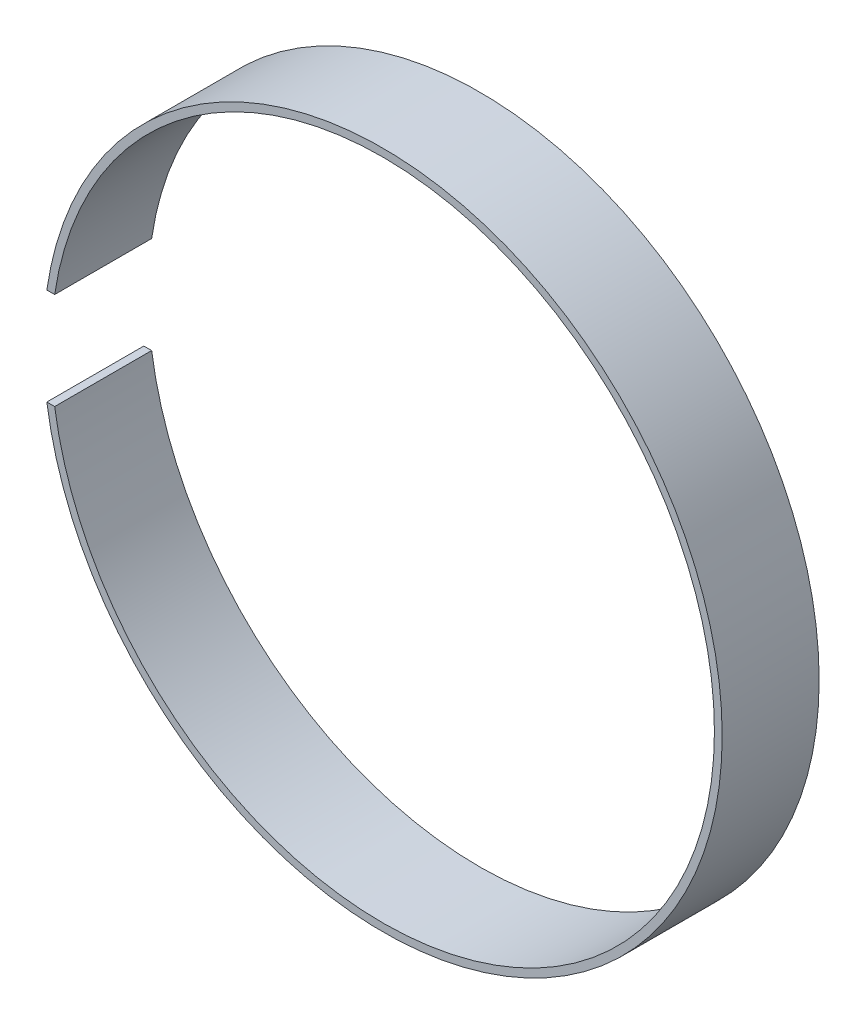
ISO-10303-21;
HEADER;
FILE_DESCRIPTION(('STEP AP214'),'2;1');
FILE_NAME('part.step','',(''),(''),'','','');
FILE_SCHEMA(('AUTOMOTIVE_DESIGN { 1 0 10303 214 1 1 1 1 }'));
ENDSEC;
DATA;
#1=APPLICATION_CONTEXT('core data for automotive mechanical design processes');
#2=APPLICATION_PROTOCOL_DEFINITION('international standard','automotive_design',2000,#1);
#3=PRODUCT_CONTEXT('',#1,'mechanical');
#4=PRODUCT('Part','Part','',(#3));
#5=PRODUCT_RELATED_PRODUCT_CATEGORY('part','',(#4));
#6=PRODUCT_DEFINITION_FORMATION('','',#4);
#7=PRODUCT_DEFINITION_CONTEXT('part definition',#1,'design');
#8=PRODUCT_DEFINITION('design','',#6,#7);
#9=PRODUCT_DEFINITION_SHAPE('','',#8);
#10=(LENGTH_UNIT() NAMED_UNIT(*) SI_UNIT(.MILLI.,.METRE.));
#11=(NAMED_UNIT(*) PLANE_ANGLE_UNIT() SI_UNIT($,.RADIAN.));
#12=(NAMED_UNIT(*) SI_UNIT($,.STERADIAN.) SOLID_ANGLE_UNIT());
#13=UNCERTAINTY_MEASURE_WITH_UNIT(LENGTH_MEASURE(1.E-05),#10,'distance_accuracy_value','');
#14=(GEOMETRIC_REPRESENTATION_CONTEXT(3) GLOBAL_UNCERTAINTY_ASSIGNED_CONTEXT((#13)) GLOBAL_UNIT_ASSIGNED_CONTEXT((#10,
#11,#12)) REPRESENTATION_CONTEXT('',''));
#15=CARTESIAN_POINT('',(0.,0.,0.));
#16=DIRECTION('',(0.,0.,1.));
#17=DIRECTION('',(1.,0.,0.));
#18=AXIS2_PLACEMENT_3D('',#15,#16,#17);
#19=CARTESIAN_POINT('',(0.,0.,250.));
#20=DIRECTION('',(0.,0.,-1.));
#21=DIRECTION('',(-1.,0.,0.));
#22=AXIS2_PLACEMENT_3D('',#19,#20,#21);
#23=CYLINDRICAL_SURFACE('',#22,875.);
#24=CARTESIAN_POINT('',(0.,0.,0.));
#25=DIRECTION('',(0.,0.,1.));
#26=DIRECTION('',(1.,0.,0.));
#27=AXIS2_PLACEMENT_3D('',#24,#25,#26);
#28=CIRCLE('',#27,875.);
#29=CARTESIAN_POINT('',(-866.025403784439,-125.,0.));
#30=VERTEX_POINT('',#29);
#31=CARTESIAN_POINT('',(-866.025403784439,125.,0.));
#32=VERTEX_POINT('',#31);
#33=EDGE_CURVE('E95',#30,#32,#28,.T.);
#34=ORIENTED_EDGE('',*,*,#33,.T.);
#35=DIRECTION('',(0.,0.,-1.));
#36=VECTOR('',#35,1.);
#37=CARTESIAN_POINT('',(-866.025403784439,125.,250.));
#38=LINE('',#37,#36);
#39=CARTESIAN_POINT('',(-866.025403784439,125.,250.));
#40=VERTEX_POINT('',#39);
#41=EDGE_CURVE('E11',#40,#32,#38,.T.);
#42=ORIENTED_EDGE('',*,*,#41,.F.);
#43=CARTESIAN_POINT('',(0.,0.,250.));
#44=DIRECTION('',(0.,0.,1.));
#45=DIRECTION('',(1.,0.,0.));
#46=AXIS2_PLACEMENT_3D('',#43,#44,#45);
#47=CIRCLE('',#46,875.);
#48=CARTESIAN_POINT('',(-866.025403784439,-125.,250.));
#49=VERTEX_POINT('',#48);
#50=EDGE_CURVE('E83',#49,#40,#47,.T.);
#51=ORIENTED_EDGE('',*,*,#50,.F.);
#52=DIRECTION('',(0.,0.,-1.));
#53=VECTOR('',#52,1.);
#54=CARTESIAN_POINT('',(-866.025403784439,-125.,250.));
#55=LINE('',#54,#53);
#56=EDGE_CURVE('E91',#49,#30,#55,.T.);
#57=ORIENTED_EDGE('',*,*,#56,.T.);
#58=EDGE_LOOP('',(#34,#42,#51,#57));
#59=FACE_BOUND('',#58,.T.);
#60=ADVANCED_FACE('F32',(#59),#23,.T.);
#61=CARTESIAN_POINT('',(-866.025403784439,125.,250.));
#62=DIRECTION('',(0.,1.,0.));
#63=DIRECTION('',(0.,0.,1.));
#64=AXIS2_PLACEMENT_3D('',#61,#62,#63);
#65=PLANE('',#64);
#66=DIRECTION('',(1.,0.,0.));
#67=VECTOR('',#66,1.);
#68=CARTESIAN_POINT('',(-866.025403784439,125.,0.));
#69=LINE('',#68,#67);
#70=CARTESIAN_POINT('',(-845.81321815162,125.,0.));
#71=VERTEX_POINT('',#70);
#72=EDGE_CURVE('E87',#32,#71,#69,.T.);
#73=ORIENTED_EDGE('',*,*,#72,.T.);
#74=DIRECTION('',(0.,0.,-1.));
#75=VECTOR('',#74,1.);
#76=CARTESIAN_POINT('',(-845.81321815162,125.,250.));
#77=LINE('',#76,#75);
#78=CARTESIAN_POINT('',(-845.81321815162,125.,250.));
#79=VERTEX_POINT('',#78);
#80=EDGE_CURVE('E40',#79,#71,#77,.T.);
#81=ORIENTED_EDGE('',*,*,#80,.F.);
#82=DIRECTION('',(1.,0.,0.));
#83=VECTOR('',#82,1.);
#84=CARTESIAN_POINT('',(-866.025403784439,125.,250.));
#85=LINE('',#84,#83);
#86=EDGE_CURVE('E78',#40,#79,#85,.T.);
#87=ORIENTED_EDGE('',*,*,#86,.F.);
#88=ORIENTED_EDGE('',*,*,#41,.T.);
#89=EDGE_LOOP('',(#73,#81,#87,#88));
#90=FACE_BOUND('',#89,.T.);
#91=ADVANCED_FACE('F86',(#90),#65,.F.);
#92=CARTESIAN_POINT('',(0.,0.,250.));
#93=DIRECTION('',(0.,0.,-1.));
#94=DIRECTION('',(-1.,0.,0.));
#95=AXIS2_PLACEMENT_3D('',#92,#93,#94);
#96=CYLINDRICAL_SURFACE('',#95,855.);
#97=CARTESIAN_POINT('',(0.,0.,0.));
#98=DIRECTION('',(0.,0.,-1.));
#99=DIRECTION('',(1.,0.,0.));
#100=AXIS2_PLACEMENT_3D('',#97,#98,#99);
#101=CIRCLE('',#100,855.);
#102=CARTESIAN_POINT('',(-845.81321815162,-125.,0.));
#103=VERTEX_POINT('',#102);
#104=EDGE_CURVE('E65',#71,#103,#101,.T.);
#105=ORIENTED_EDGE('',*,*,#104,.T.);
#106=DIRECTION('',(0.,0.,-1.));
#107=VECTOR('',#106,1.);
#108=CARTESIAN_POINT('',(-845.81321815162,-125.,250.));
#109=LINE('',#108,#107);
#110=CARTESIAN_POINT('',(-845.81321815162,-125.,250.));
#111=VERTEX_POINT('',#110);
#112=EDGE_CURVE('E88',#111,#103,#109,.T.);
#113=ORIENTED_EDGE('',*,*,#112,.F.);
#114=CARTESIAN_POINT('',(0.,0.,250.));
#115=DIRECTION('',(0.,0.,-1.));
#116=DIRECTION('',(1.,0.,0.));
#117=AXIS2_PLACEMENT_3D('',#114,#115,#116);
#118=CIRCLE('',#117,855.);
#119=EDGE_CURVE('E81',#79,#111,#118,.T.);
#120=ORIENTED_EDGE('',*,*,#119,.F.);
#121=ORIENTED_EDGE('',*,*,#80,.T.);
#122=EDGE_LOOP('',(#105,#113,#120,#121));
#123=FACE_BOUND('',#122,.T.);
#124=ADVANCED_FACE('F89',(#123),#96,.F.);
#125=CARTESIAN_POINT('',(-866.025403784439,-125.,250.));
#126=DIRECTION('',(0.,-1.,0.));
#127=DIRECTION('',(0.,0.,-1.));
#128=AXIS2_PLACEMENT_3D('',#125,#126,#127);
#129=PLANE('',#128);
#130=DIRECTION('',(-1.,0.,0.));
#131=VECTOR('',#130,1.);
#132=CARTESIAN_POINT('',(-866.025403784439,-125.,0.));
#133=LINE('',#132,#131);
#134=EDGE_CURVE('E71',#103,#30,#133,.T.);
#135=ORIENTED_EDGE('',*,*,#134,.T.);
#136=ORIENTED_EDGE('',*,*,#56,.F.);
#137=DIRECTION('',(-1.,0.,0.));
#138=VECTOR('',#137,1.);
#139=CARTESIAN_POINT('',(-866.025403784439,-125.,250.));
#140=LINE('',#139,#138);
#141=EDGE_CURVE('E48',#111,#49,#140,.T.);
#142=ORIENTED_EDGE('',*,*,#141,.F.);
#143=ORIENTED_EDGE('',*,*,#112,.T.);
#144=EDGE_LOOP('',(#135,#136,#142,#143));
#145=FACE_BOUND('',#144,.T.);
#146=ADVANCED_FACE('F102',(#145),#129,.F.);
#147=CARTESIAN_POINT('',(0.,0.,250.));
#148=DIRECTION('',(0.,0.,1.));
#149=DIRECTION('',(1.,0.,0.));
#150=AXIS2_PLACEMENT_3D('',#147,#148,#149);
#151=PLANE('',#150);
#152=ORIENTED_EDGE('',*,*,#50,.T.);
#153=ORIENTED_EDGE('',*,*,#86,.T.);
#154=ORIENTED_EDGE('',*,*,#119,.T.);
#155=ORIENTED_EDGE('',*,*,#141,.T.);
#156=EDGE_LOOP('',(#152,#153,#154,#155));
#157=FACE_BOUND('',#156,.T.);
#158=ADVANCED_FACE('F79',(#157),#151,.T.);
#159=CARTESIAN_POINT('',(0.,0.,0.));
#160=DIRECTION('',(0.,0.,1.));
#161=DIRECTION('',(1.,0.,0.));
#162=AXIS2_PLACEMENT_3D('',#159,#160,#161);
#163=PLANE('',#162);
#164=ORIENTED_EDGE('',*,*,#33,.F.);
#165=ORIENTED_EDGE('',*,*,#134,.F.);
#166=ORIENTED_EDGE('',*,*,#104,.F.);
#167=ORIENTED_EDGE('',*,*,#72,.F.);
#168=EDGE_LOOP('',(#164,#165,#166,#167));
#169=FACE_BOUND('',#168,.T.);
#170=ADVANCED_FACE('F105',(#169),#163,.F.);
#171=CLOSED_SHELL('',(#60,#91,#124,#146,#158,#170));
#172=MANIFOLD_SOLID_BREP('B2',#171);
#173=ADVANCED_BREP_SHAPE_REPRESENTATION('',(#18,#172),#14);
#174=SHAPE_DEFINITION_REPRESENTATION(#9,#173);
ENDSEC;
END-ISO-10303-21;
